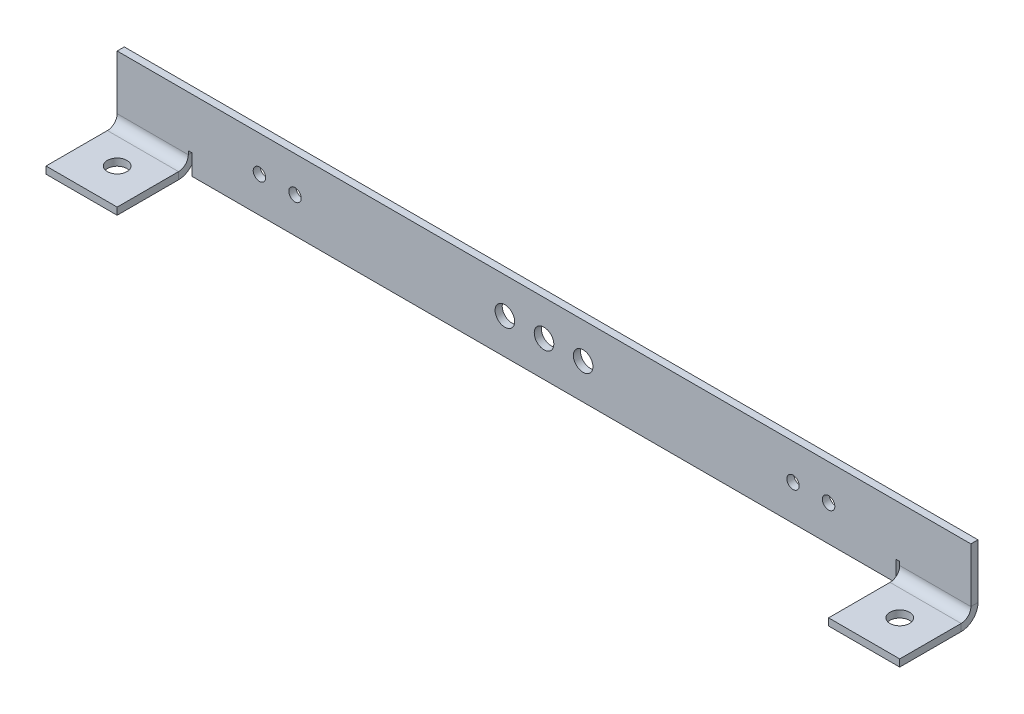
ISO-10303-21;
HEADER;
FILE_DESCRIPTION(('STEP AP214'),'2;1');
FILE_NAME('part.step','',(''),(''),'','','');
FILE_SCHEMA(('AUTOMOTIVE_DESIGN { 1 0 10303 214 1 1 1 1 }'));
ENDSEC;
DATA;
#1=APPLICATION_CONTEXT('core data for automotive mechanical design processes');
#2=APPLICATION_PROTOCOL_DEFINITION('international standard','automotive_design',2000,#1);
#3=PRODUCT_CONTEXT('',#1,'mechanical');
#4=PRODUCT('Part','Part','',(#3));
#5=PRODUCT_RELATED_PRODUCT_CATEGORY('part','',(#4));
#6=PRODUCT_DEFINITION_FORMATION('','',#4);
#7=PRODUCT_DEFINITION_CONTEXT('part definition',#1,'design');
#8=PRODUCT_DEFINITION('design','',#6,#7);
#9=PRODUCT_DEFINITION_SHAPE('','',#8);
#10=(LENGTH_UNIT() NAMED_UNIT(*) SI_UNIT(.MILLI.,.METRE.));
#11=(NAMED_UNIT(*) PLANE_ANGLE_UNIT() SI_UNIT($,.RADIAN.));
#12=(NAMED_UNIT(*) SI_UNIT($,.STERADIAN.) SOLID_ANGLE_UNIT());
#13=UNCERTAINTY_MEASURE_WITH_UNIT(LENGTH_MEASURE(1.E-05),#10,'distance_accuracy_value','');
#14=(GEOMETRIC_REPRESENTATION_CONTEXT(3) GLOBAL_UNCERTAINTY_ASSIGNED_CONTEXT((#13)) GLOBAL_UNIT_ASSIGNED_CONTEXT((#10,
#11,#12)) REPRESENTATION_CONTEXT('',''));
#15=CARTESIAN_POINT('',(0.,0.,0.));
#16=DIRECTION('',(0.,0.,1.));
#17=DIRECTION('',(1.,0.,0.));
#18=AXIS2_PLACEMENT_3D('',#15,#16,#17);
#19=CARTESIAN_POINT('',(120.,-20.,-2.));
#20=DIRECTION('',(0.,-1.,0.));
#21=DIRECTION('',(0.,0.,-1.));
#22=AXIS2_PLACEMENT_3D('',#19,#20,#21);
#23=PLANE('',#22);
#24=DIRECTION('',(1.,0.,0.));
#25=VECTOR('',#24,1.);
#26=CARTESIAN_POINT('',(120.,-20.,-2.));
#27=LINE('',#26,#25);
#28=CARTESIAN_POINT('',(-99.,-20.,-2.));
#29=VERTEX_POINT('',#28);
#30=CARTESIAN_POINT('',(99.,-20.,-2.));
#31=VERTEX_POINT('',#30);
#32=EDGE_CURVE('E359',#29,#31,#27,.T.);
#33=ORIENTED_EDGE('',*,*,#32,.T.);
#34=DIRECTION('',(0.,0.,-1.));
#35=VECTOR('',#34,1.);
#36=CARTESIAN_POINT('',(99.,-20.,0.));
#37=LINE('',#36,#35);
#38=CARTESIAN_POINT('',(99.,-20.,0.));
#39=VERTEX_POINT('',#38);
#40=EDGE_CURVE('E255',#39,#31,#37,.T.);
#41=ORIENTED_EDGE('',*,*,#40,.F.);
#42=DIRECTION('',(1.,0.,0.));
#43=VECTOR('',#42,1.);
#44=CARTESIAN_POINT('',(120.,-20.,0.));
#45=LINE('',#44,#43);
#46=CARTESIAN_POINT('',(-99.,-20.,0.));
#47=VERTEX_POINT('',#46);
#48=EDGE_CURVE('E130',#47,#39,#45,.T.);
#49=ORIENTED_EDGE('',*,*,#48,.F.);
#50=DIRECTION('',(0.,0.,-1.));
#51=VECTOR('',#50,1.);
#52=CARTESIAN_POINT('',(-99.,-20.,0.));
#53=LINE('',#52,#51);
#54=EDGE_CURVE('E340',#47,#29,#53,.T.);
#55=ORIENTED_EDGE('',*,*,#54,.T.);
#56=EDGE_LOOP('',(#33,#41,#49,#55));
#57=FACE_BOUND('',#56,.T.);
#58=ADVANCED_FACE('F79',(#57),#23,.T.);
#59=CARTESIAN_POINT('',(0.,0.,-2.));
#60=DIRECTION('',(0.,0.,1.));
#61=DIRECTION('',(1.,0.,0.));
#62=AXIS2_PLACEMENT_3D('',#59,#60,#61);
#63=PLANE('',#62);
#64=CARTESIAN_POINT('',(-70.,-9.99999999999998,-2.));
#65=DIRECTION('',(0.,0.,-1.));
#66=DIRECTION('',(1.,0.,0.));
#67=AXIS2_PLACEMENT_3D('',#64,#65,#66);
#68=CIRCLE('',#67,1.75);
#69=CARTESIAN_POINT('',(-68.25,-9.99999999999998,-2.));
#70=VERTEX_POINT('',#69);
#71=EDGE_CURVE('E657',#70,#70,#68,.T.);
#72=ORIENTED_EDGE('',*,*,#71,.F.);
#73=EDGE_LOOP('',(#72));
#74=FACE_BOUND('',#73,.T.);
#75=CARTESIAN_POINT('',(-80.,-9.99999999999998,-2.));
#76=DIRECTION('',(0.,0.,-1.));
#77=DIRECTION('',(1.,0.,0.));
#78=AXIS2_PLACEMENT_3D('',#75,#76,#77);
#79=CIRCLE('',#78,1.75);
#80=CARTESIAN_POINT('',(-78.25,-9.99999999999998,-2.));
#81=VERTEX_POINT('',#80);
#82=EDGE_CURVE('E652',#81,#81,#79,.T.);
#83=ORIENTED_EDGE('',*,*,#82,.F.);
#84=EDGE_LOOP('',(#83));
#85=FACE_BOUND('',#84,.T.);
#86=CARTESIAN_POINT('',(70.,-10.,-2.));
#87=DIRECTION('',(0.,0.,-1.));
#88=DIRECTION('',(-1.,0.,0.));
#89=AXIS2_PLACEMENT_3D('',#86,#87,#88);
#90=CIRCLE('',#89,1.75);
#91=CARTESIAN_POINT('',(68.25,-10.,-2.));
#92=VERTEX_POINT('',#91);
#93=EDGE_CURVE('E649',#92,#92,#90,.T.);
#94=ORIENTED_EDGE('',*,*,#93,.F.);
#95=EDGE_LOOP('',(#94));
#96=FACE_BOUND('',#95,.T.);
#97=CARTESIAN_POINT('',(11.,-10.,-2.));
#98=DIRECTION('',(0.,0.,-1.));
#99=DIRECTION('',(-1.,0.,0.));
#100=AXIS2_PLACEMENT_3D('',#97,#98,#99);
#101=CIRCLE('',#100,2.75);
#102=CARTESIAN_POINT('',(8.25,-10.,-2.));
#103=VERTEX_POINT('',#102);
#104=EDGE_CURVE('E159',#103,#103,#101,.T.);
#105=ORIENTED_EDGE('',*,*,#104,.F.);
#106=EDGE_LOOP('',(#105));
#107=FACE_BOUND('',#106,.T.);
#108=CARTESIAN_POINT('',(-11.,-10.,-2.));
#109=DIRECTION('',(0.,0.,-1.));
#110=DIRECTION('',(1.,0.,0.));
#111=AXIS2_PLACEMENT_3D('',#108,#109,#110);
#112=CIRCLE('',#111,2.75);
#113=CARTESIAN_POINT('',(-8.25,-10.,-2.));
#114=VERTEX_POINT('',#113);
#115=EDGE_CURVE('E655',#114,#114,#112,.T.);
#116=ORIENTED_EDGE('',*,*,#115,.F.);
#117=EDGE_LOOP('',(#116));
#118=FACE_BOUND('',#117,.T.);
#119=CARTESIAN_POINT('',(80.,-10.,-2.));
#120=DIRECTION('',(0.,0.,-1.));
#121=DIRECTION('',(-1.,0.,0.));
#122=AXIS2_PLACEMENT_3D('',#119,#120,#121);
#123=CIRCLE('',#122,1.75);
#124=CARTESIAN_POINT('',(78.25,-10.,-2.));
#125=VERTEX_POINT('',#124);
#126=EDGE_CURVE('E651',#125,#125,#123,.T.);
#127=ORIENTED_EDGE('',*,*,#126,.F.);
#128=EDGE_LOOP('',(#127));
#129=FACE_BOUND('',#128,.T.);
#130=CARTESIAN_POINT('',(0.,-10.,-2.));
#131=DIRECTION('',(0.,0.,-1.));
#132=DIRECTION('',(-1.,0.,0.));
#133=AXIS2_PLACEMENT_3D('',#130,#131,#132);
#134=CIRCLE('',#133,2.75);
#135=CARTESIAN_POINT('',(-2.75,-10.,-2.));
#136=VERTEX_POINT('',#135);
#137=EDGE_CURVE('E154',#136,#136,#134,.T.);
#138=ORIENTED_EDGE('',*,*,#137,.F.);
#139=EDGE_LOOP('',(#138));
#140=FACE_BOUND('',#139,.T.);
#141=DIRECTION('',(1.,0.,0.));
#142=VECTOR('',#141,1.);
#143=CARTESIAN_POINT('',(120.,-15.2634,-2.));
#144=LINE('',#143,#142);
#145=CARTESIAN_POINT('',(120.,-15.2634,-2.));
#146=VERTEX_POINT('',#145);
#147=CARTESIAN_POINT('',(100.,-15.2634,-2.));
#148=VERTEX_POINT('',#147);
#149=EDGE_CURVE('E223',#146,#148,#144,.F.);
#150=ORIENTED_EDGE('',*,*,#149,.T.);
#151=DIRECTION('',(0.,-1.,0.));
#152=VECTOR('',#151,1.);
#153=CARTESIAN_POINT('',(100.,0.,-2.));
#154=LINE('',#153,#152);
#155=CARTESIAN_POINT('',(100.,-14.2634,-2.));
#156=VERTEX_POINT('',#155);
#157=EDGE_CURVE('E267',#156,#148,#154,.T.);
#158=ORIENTED_EDGE('',*,*,#157,.F.);
#159=DIRECTION('',(1.,0.,0.));
#160=VECTOR('',#159,1.);
#161=CARTESIAN_POINT('',(0.,-14.2634,-2.));
#162=LINE('',#161,#160);
#163=CARTESIAN_POINT('',(99.,-14.2634,-2.));
#164=VERTEX_POINT('',#163);
#165=EDGE_CURVE('E264',#164,#156,#162,.T.);
#166=ORIENTED_EDGE('',*,*,#165,.F.);
#167=DIRECTION('',(0.,1.,0.));
#168=VECTOR('',#167,1.);
#169=CARTESIAN_POINT('',(99.,0.,-2.));
#170=LINE('',#169,#168);
#171=EDGE_CURVE('E247',#31,#164,#170,.T.);
#172=ORIENTED_EDGE('',*,*,#171,.F.);
#173=ORIENTED_EDGE('',*,*,#32,.F.);
#174=DIRECTION('',(0.,-1.,0.));
#175=VECTOR('',#174,1.);
#176=CARTESIAN_POINT('',(-99.,0.,-2.));
#177=LINE('',#176,#175);
#178=CARTESIAN_POINT('',(-99.,-14.2634,-2.));
#179=VERTEX_POINT('',#178);
#180=EDGE_CURVE('E138',#179,#29,#177,.T.);
#181=ORIENTED_EDGE('',*,*,#180,.F.);
#182=DIRECTION('',(1.,0.,0.));
#183=VECTOR('',#182,1.);
#184=CARTESIAN_POINT('',(0.,-14.2634,-2.));
#185=LINE('',#184,#183);
#186=CARTESIAN_POINT('',(-100.,-14.2634,-2.));
#187=VERTEX_POINT('',#186);
#188=EDGE_CURVE('E142',#187,#179,#185,.T.);
#189=ORIENTED_EDGE('',*,*,#188,.F.);
#190=DIRECTION('',(0.,1.,0.));
#191=VECTOR('',#190,1.);
#192=CARTESIAN_POINT('',(-100.,0.,-2.));
#193=LINE('',#192,#191);
#194=CARTESIAN_POINT('',(-100.,-15.2634,-2.));
#195=VERTEX_POINT('',#194);
#196=EDGE_CURVE('E339',#195,#187,#193,.T.);
#197=ORIENTED_EDGE('',*,*,#196,.F.);
#198=DIRECTION('',(1.,0.,0.));
#199=VECTOR('',#198,1.);
#200=CARTESIAN_POINT('',(-100.,-15.2634,-2.));
#201=LINE('',#200,#199);
#202=CARTESIAN_POINT('',(-120.,-15.2634,-2.));
#203=VERTEX_POINT('',#202);
#204=EDGE_CURVE('E313',#195,#203,#201,.F.);
#205=ORIENTED_EDGE('',*,*,#204,.T.);
#206=DIRECTION('',(0.,-1.,0.));
#207=VECTOR('',#206,1.);
#208=CARTESIAN_POINT('',(-120.,-20.,-2.));
#209=LINE('',#208,#207);
#210=CARTESIAN_POINT('',(-120.,0.,-2.));
#211=VERTEX_POINT('',#210);
#212=EDGE_CURVE('E357',#211,#203,#209,.T.);
#213=ORIENTED_EDGE('',*,*,#212,.F.);
#214=DIRECTION('',(-1.,0.,0.));
#215=VECTOR('',#214,1.);
#216=CARTESIAN_POINT('',(-120.,0.,-2.));
#217=LINE('',#216,#215);
#218=CARTESIAN_POINT('',(120.,0.,-2.));
#219=VERTEX_POINT('',#218);
#220=EDGE_CURVE('E129',#219,#211,#217,.T.);
#221=ORIENTED_EDGE('',*,*,#220,.F.);
#222=DIRECTION('',(0.,1.,0.));
#223=VECTOR('',#222,1.);
#224=CARTESIAN_POINT('',(120.,-20.,-2.));
#225=LINE('',#224,#223);
#226=EDGE_CURVE('E104',#146,#219,#225,.T.);
#227=ORIENTED_EDGE('',*,*,#226,.F.);
#228=EDGE_LOOP('',(#150,#158,#166,#172,#173,#181,#189,#197,#205,#213,#221,#227));
#229=FACE_BOUND('',#228,.T.);
#230=ADVANCED_FACE('F374',(#74,#85,#96,#107,#118,#129,#140,#229),#63,.F.);
#231=CARTESIAN_POINT('',(0.,0.,0.));
#232=DIRECTION('',(0.,0.,1.));
#233=DIRECTION('',(1.,0.,0.));
#234=AXIS2_PLACEMENT_3D('',#231,#232,#233);
#235=PLANE('',#234);
#236=CARTESIAN_POINT('',(-70.,-9.99999999999998,0.));
#237=DIRECTION('',(0.,0.,1.));
#238=DIRECTION('',(1.,0.,0.));
#239=AXIS2_PLACEMENT_3D('',#236,#237,#238);
#240=CIRCLE('',#239,1.75);
#241=CARTESIAN_POINT('',(-68.25,-9.99999999999998,0.));
#242=VERTEX_POINT('',#241);
#243=EDGE_CURVE('E83',#242,#242,#240,.T.);
#244=ORIENTED_EDGE('',*,*,#243,.F.);
#245=EDGE_LOOP('',(#244));
#246=FACE_BOUND('',#245,.T.);
#247=CARTESIAN_POINT('',(-80.,-9.99999999999998,0.));
#248=DIRECTION('',(0.,0.,1.));
#249=DIRECTION('',(1.,0.,0.));
#250=AXIS2_PLACEMENT_3D('',#247,#248,#249);
#251=CIRCLE('',#250,1.75);
#252=CARTESIAN_POINT('',(-78.25,-9.99999999999998,0.));
#253=VERTEX_POINT('',#252);
#254=EDGE_CURVE('E167',#253,#253,#251,.T.);
#255=ORIENTED_EDGE('',*,*,#254,.F.);
#256=EDGE_LOOP('',(#255));
#257=FACE_BOUND('',#256,.T.);
#258=CARTESIAN_POINT('',(70.,-10.,0.));
#259=DIRECTION('',(0.,0.,1.));
#260=DIRECTION('',(1.,0.,0.));
#261=AXIS2_PLACEMENT_3D('',#258,#259,#260);
#262=CIRCLE('',#261,1.75);
#263=CARTESIAN_POINT('',(71.75,-10.,0.));
#264=VERTEX_POINT('',#263);
#265=EDGE_CURVE('E165',#264,#264,#262,.T.);
#266=ORIENTED_EDGE('',*,*,#265,.F.);
#267=EDGE_LOOP('',(#266));
#268=FACE_BOUND('',#267,.T.);
#269=CARTESIAN_POINT('',(11.,-10.,0.));
#270=DIRECTION('',(0.,0.,1.));
#271=DIRECTION('',(1.,0.,0.));
#272=AXIS2_PLACEMENT_3D('',#269,#270,#271);
#273=CIRCLE('',#272,2.75);
#274=CARTESIAN_POINT('',(13.75,-10.,0.));
#275=VERTEX_POINT('',#274);
#276=EDGE_CURVE('E162',#275,#275,#273,.T.);
#277=ORIENTED_EDGE('',*,*,#276,.F.);
#278=EDGE_LOOP('',(#277));
#279=FACE_BOUND('',#278,.T.);
#280=CARTESIAN_POINT('',(-11.,-10.,0.));
#281=DIRECTION('',(0.,0.,1.));
#282=DIRECTION('',(1.,0.,0.));
#283=AXIS2_PLACEMENT_3D('',#280,#281,#282);
#284=CIRCLE('',#283,2.75);
#285=CARTESIAN_POINT('',(-8.25,-10.,0.));
#286=VERTEX_POINT('',#285);
#287=EDGE_CURVE('E158',#286,#286,#284,.T.);
#288=ORIENTED_EDGE('',*,*,#287,.F.);
#289=EDGE_LOOP('',(#288));
#290=FACE_BOUND('',#289,.T.);
#291=CARTESIAN_POINT('',(80.,-10.,0.));
#292=DIRECTION('',(0.,0.,1.));
#293=DIRECTION('',(1.,0.,0.));
#294=AXIS2_PLACEMENT_3D('',#291,#292,#293);
#295=CIRCLE('',#294,1.75);
#296=CARTESIAN_POINT('',(81.75,-10.,0.));
#297=VERTEX_POINT('',#296);
#298=EDGE_CURVE('E155',#297,#297,#295,.T.);
#299=ORIENTED_EDGE('',*,*,#298,.F.);
#300=EDGE_LOOP('',(#299));
#301=FACE_BOUND('',#300,.T.);
#302=CARTESIAN_POINT('',(0.,-10.,0.));
#303=DIRECTION('',(0.,0.,1.));
#304=DIRECTION('',(1.,0.,0.));
#305=AXIS2_PLACEMENT_3D('',#302,#303,#304);
#306=CIRCLE('',#305,2.75);
#307=CARTESIAN_POINT('',(2.75,-10.,0.));
#308=VERTEX_POINT('',#307);
#309=EDGE_CURVE('E150',#308,#308,#306,.T.);
#310=ORIENTED_EDGE('',*,*,#309,.F.);
#311=EDGE_LOOP('',(#310));
#312=FACE_BOUND('',#311,.T.);
#313=DIRECTION('',(0.,1.,0.));
#314=VECTOR('',#313,1.);
#315=CARTESIAN_POINT('',(100.,-15.2634,0.));
#316=LINE('',#315,#314);
#317=CARTESIAN_POINT('',(100.,-15.2634,0.));
#318=VERTEX_POINT('',#317);
#319=CARTESIAN_POINT('',(100.,-14.2634,0.));
#320=VERTEX_POINT('',#319);
#321=EDGE_CURVE('E244',#318,#320,#316,.T.);
#322=ORIENTED_EDGE('',*,*,#321,.F.);
#323=DIRECTION('',(1.,0.,0.));
#324=VECTOR('',#323,1.);
#325=CARTESIAN_POINT('',(120.,-15.2634,0.));
#326=LINE('',#325,#324);
#327=CARTESIAN_POINT('',(120.,-15.2634,0.));
#328=VERTEX_POINT('',#327);
#329=EDGE_CURVE('E127',#328,#318,#326,.F.);
#330=ORIENTED_EDGE('',*,*,#329,.F.);
#331=DIRECTION('',(0.,1.,0.));
#332=VECTOR('',#331,1.);
#333=CARTESIAN_POINT('',(120.,-20.,0.));
#334=LINE('',#333,#332);
#335=CARTESIAN_POINT('',(120.,0.,0.));
#336=VERTEX_POINT('',#335);
#337=EDGE_CURVE('E119',#328,#336,#334,.T.);
#338=ORIENTED_EDGE('',*,*,#337,.T.);
#339=DIRECTION('',(-1.,0.,0.));
#340=VECTOR('',#339,1.);
#341=CARTESIAN_POINT('',(-120.,0.,0.));
#342=LINE('',#341,#340);
#343=CARTESIAN_POINT('',(-120.,0.,0.));
#344=VERTEX_POINT('',#343);
#345=EDGE_CURVE('E124',#336,#344,#342,.T.);
#346=ORIENTED_EDGE('',*,*,#345,.T.);
#347=DIRECTION('',(0.,-1.,0.));
#348=VECTOR('',#347,1.);
#349=CARTESIAN_POINT('',(-120.,-20.,0.));
#350=LINE('',#349,#348);
#351=CARTESIAN_POINT('',(-120.,-15.2634,0.));
#352=VERTEX_POINT('',#351);
#353=EDGE_CURVE('E137',#344,#352,#350,.T.);
#354=ORIENTED_EDGE('',*,*,#353,.T.);
#355=DIRECTION('',(1.,0.,0.));
#356=VECTOR('',#355,1.);
#357=CARTESIAN_POINT('',(-100.,-15.2634,0.));
#358=LINE('',#357,#356);
#359=CARTESIAN_POINT('',(-100.,-15.2634,0.));
#360=VERTEX_POINT('',#359);
#361=EDGE_CURVE('E326',#360,#352,#358,.F.);
#362=ORIENTED_EDGE('',*,*,#361,.F.);
#363=DIRECTION('',(0.,-1.,0.));
#364=VECTOR('',#363,1.);
#365=CARTESIAN_POINT('',(-100.,-14.2634,0.));
#366=LINE('',#365,#364);
#367=CARTESIAN_POINT('',(-100.,-14.2634,0.));
#368=VERTEX_POINT('',#367);
#369=EDGE_CURVE('E96',#368,#360,#366,.T.);
#370=ORIENTED_EDGE('',*,*,#369,.F.);
#371=DIRECTION('',(-1.,0.,0.));
#372=VECTOR('',#371,1.);
#373=CARTESIAN_POINT('',(-99.,-14.2634,0.));
#374=LINE('',#373,#372);
#375=CARTESIAN_POINT('',(-99.,-14.2634,0.));
#376=VERTEX_POINT('',#375);
#377=EDGE_CURVE('E341',#376,#368,#374,.T.);
#378=ORIENTED_EDGE('',*,*,#377,.F.);
#379=DIRECTION('',(0.,1.,0.));
#380=VECTOR('',#379,1.);
#381=CARTESIAN_POINT('',(-99.,-20.,0.));
#382=LINE('',#381,#380);
#383=EDGE_CURVE('E336',#47,#376,#382,.T.);
#384=ORIENTED_EDGE('',*,*,#383,.F.);
#385=ORIENTED_EDGE('',*,*,#48,.T.);
#386=DIRECTION('',(0.,-1.,0.));
#387=VECTOR('',#386,1.);
#388=CARTESIAN_POINT('',(99.,-14.2634,0.));
#389=LINE('',#388,#387);
#390=CARTESIAN_POINT('',(99.,-14.2634,0.));
#391=VERTEX_POINT('',#390);
#392=EDGE_CURVE('E252',#391,#39,#389,.T.);
#393=ORIENTED_EDGE('',*,*,#392,.F.);
#394=DIRECTION('',(-1.,0.,0.));
#395=VECTOR('',#394,1.);
#396=CARTESIAN_POINT('',(100.,-14.2634,0.));
#397=LINE('',#396,#395);
#398=EDGE_CURVE('E248',#320,#391,#397,.T.);
#399=ORIENTED_EDGE('',*,*,#398,.F.);
#400=EDGE_LOOP('',(#322,#330,#338,#346,#354,#362,#370,#378,#384,#385,#393,#399));
#401=FACE_BOUND('',#400,.T.);
#402=ADVANCED_FACE('F121',(#246,#257,#268,#279,#290,#301,#312,#401),#235,.T.);
#403=CARTESIAN_POINT('',(120.,-20.,-2.));
#404=DIRECTION('',(1.,0.,0.));
#405=DIRECTION('',(0.,0.,-1.));
#406=AXIS2_PLACEMENT_3D('',#403,#404,#405);
#407=PLANE('',#406);
#408=ORIENTED_EDGE('',*,*,#337,.F.);
#409=DIRECTION('',(0.,0.,-1.));
#410=VECTOR('',#409,1.);
#411=CARTESIAN_POINT('',(120.,-15.2634,0.));
#412=LINE('',#411,#410);
#413=EDGE_CURVE('E230',#328,#146,#412,.T.);
#414=ORIENTED_EDGE('',*,*,#413,.T.);
#415=ORIENTED_EDGE('',*,*,#226,.T.);
#416=DIRECTION('',(0.,0.,1.));
#417=VECTOR('',#416,1.);
#418=CARTESIAN_POINT('',(120.,0.,-2.));
#419=LINE('',#418,#417);
#420=EDGE_CURVE('E13',#219,#336,#419,.T.);
#421=ORIENTED_EDGE('',*,*,#420,.T.);
#422=EDGE_LOOP('',(#408,#414,#415,#421));
#423=FACE_BOUND('',#422,.T.);
#424=ADVANCED_FACE('F132',(#423),#407,.T.);
#425=CARTESIAN_POINT('',(-120.,0.,-2.));
#426=DIRECTION('',(0.,1.,0.));
#427=DIRECTION('',(0.,0.,1.));
#428=AXIS2_PLACEMENT_3D('',#425,#426,#427);
#429=PLANE('',#428);
#430=ORIENTED_EDGE('',*,*,#345,.F.);
#431=ORIENTED_EDGE('',*,*,#420,.F.);
#432=ORIENTED_EDGE('',*,*,#220,.T.);
#433=DIRECTION('',(0.,0.,1.));
#434=VECTOR('',#433,1.);
#435=CARTESIAN_POINT('',(-120.,0.,-2.));
#436=LINE('',#435,#434);
#437=EDGE_CURVE('E88',#211,#344,#436,.T.);
#438=ORIENTED_EDGE('',*,*,#437,.T.);
#439=EDGE_LOOP('',(#430,#431,#432,#438));
#440=FACE_BOUND('',#439,.T.);
#441=ADVANCED_FACE('F81',(#440),#429,.T.);
#442=CARTESIAN_POINT('',(-120.,-20.,-2.));
#443=DIRECTION('',(-1.,0.,0.));
#444=DIRECTION('',(0.,0.,1.));
#445=AXIS2_PLACEMENT_3D('',#442,#443,#444);
#446=PLANE('',#445);
#447=DIRECTION('',(0.,0.,-1.));
#448=VECTOR('',#447,1.);
#449=CARTESIAN_POINT('',(-120.,-15.2634,0.));
#450=LINE('',#449,#448);
#451=EDGE_CURVE('E331',#352,#203,#450,.T.);
#452=ORIENTED_EDGE('',*,*,#451,.F.);
#453=ORIENTED_EDGE('',*,*,#353,.F.);
#454=ORIENTED_EDGE('',*,*,#437,.F.);
#455=ORIENTED_EDGE('',*,*,#212,.T.);
#456=EDGE_LOOP('',(#452,#453,#454,#455));
#457=FACE_BOUND('',#456,.T.);
#458=ADVANCED_FACE('F506',(#457),#446,.T.);
#459=CARTESIAN_POINT('',(-99.,-20.,0.));
#460=DIRECTION('',(-1.,0.,0.));
#461=DIRECTION('',(0.,0.,1.));
#462=AXIS2_PLACEMENT_3D('',#459,#460,#461);
#463=PLANE('',#462);
#464=DIRECTION('',(0.,0.,-1.));
#465=VECTOR('',#464,1.);
#466=CARTESIAN_POINT('',(-99.,-14.2634,0.));
#467=LINE('',#466,#465);
#468=EDGE_CURVE('E344',#376,#179,#467,.T.);
#469=ORIENTED_EDGE('',*,*,#468,.T.);
#470=ORIENTED_EDGE('',*,*,#180,.T.);
#471=ORIENTED_EDGE('',*,*,#54,.F.);
#472=ORIENTED_EDGE('',*,*,#383,.T.);
#473=EDGE_LOOP('',(#469,#470,#471,#472));
#474=FACE_BOUND('',#473,.T.);
#475=ADVANCED_FACE('F508',(#474),#463,.T.);
#476=CARTESIAN_POINT('',(-99.,-14.2634,0.));
#477=DIRECTION('',(0.,-1.,0.));
#478=DIRECTION('',(0.,0.,-1.));
#479=AXIS2_PLACEMENT_3D('',#476,#477,#478);
#480=PLANE('',#479);
#481=DIRECTION('',(0.,0.,-1.));
#482=VECTOR('',#481,1.);
#483=CARTESIAN_POINT('',(-100.,-14.2634,0.));
#484=LINE('',#483,#482);
#485=EDGE_CURVE('E334',#368,#187,#484,.T.);
#486=ORIENTED_EDGE('',*,*,#485,.T.);
#487=ORIENTED_EDGE('',*,*,#188,.T.);
#488=ORIENTED_EDGE('',*,*,#468,.F.);
#489=ORIENTED_EDGE('',*,*,#377,.T.);
#490=EDGE_LOOP('',(#486,#487,#488,#489));
#491=FACE_BOUND('',#490,.T.);
#492=ADVANCED_FACE('F514',(#491),#480,.T.);
#493=CARTESIAN_POINT('',(-100.,-14.2634,0.));
#494=DIRECTION('',(1.,0.,0.));
#495=DIRECTION('',(0.,0.,-1.));
#496=AXIS2_PLACEMENT_3D('',#493,#494,#495);
#497=PLANE('',#496);
#498=DIRECTION('',(0.,0.,-1.));
#499=VECTOR('',#498,1.);
#500=CARTESIAN_POINT('',(-100.,-15.2634,0.));
#501=LINE('',#500,#499);
#502=EDGE_CURVE('E320',#360,#195,#501,.T.);
#503=ORIENTED_EDGE('',*,*,#502,.T.);
#504=ORIENTED_EDGE('',*,*,#196,.T.);
#505=ORIENTED_EDGE('',*,*,#485,.F.);
#506=ORIENTED_EDGE('',*,*,#369,.T.);
#507=EDGE_LOOP('',(#503,#504,#505,#506));
#508=FACE_BOUND('',#507,.T.);
#509=ADVANCED_FACE('F547',(#508),#497,.T.);
#510=CARTESIAN_POINT('',(-120.,-15.2634,2.7366));
#511=DIRECTION('',(-1.,0.,0.));
#512=DIRECTION('',(0.,0.,1.));
#513=AXIS2_PLACEMENT_3D('',#510,#511,#512);
#514=PLANE('',#513);
#515=DIRECTION('',(0.,-1.,0.));
#516=VECTOR('',#515,1.);
#517=CARTESIAN_POINT('',(-120.,-20.,2.73659999999999));
#518=LINE('',#517,#516);
#519=CARTESIAN_POINT('',(-120.,-18.,2.73659999999999));
#520=VERTEX_POINT('',#519);
#521=CARTESIAN_POINT('',(-120.,-20.,2.73659999999998));
#522=VERTEX_POINT('',#521);
#523=EDGE_CURVE('E276',#520,#522,#518,.T.);
#524=ORIENTED_EDGE('',*,*,#523,.F.);
#525=CARTESIAN_POINT('',(-120.,-15.2634,2.7366));
#526=DIRECTION('',(1.,0.,0.));
#527=DIRECTION('',(0.,0.,-1.));
#528=AXIS2_PLACEMENT_3D('',#525,#526,#527);
#529=CIRCLE('',#528,2.7366);
#530=EDGE_CURVE('E323',#352,#520,#529,.F.);
#531=ORIENTED_EDGE('',*,*,#530,.F.);
#532=ORIENTED_EDGE('',*,*,#451,.T.);
#533=CARTESIAN_POINT('',(-120.,-15.2634,2.7366));
#534=DIRECTION('',(1.,0.,0.));
#535=DIRECTION('',(0.,0.,-1.));
#536=AXIS2_PLACEMENT_3D('',#533,#534,#535);
#537=CIRCLE('',#536,4.7366);
#538=EDGE_CURVE('E316',#203,#522,#537,.F.);
#539=ORIENTED_EDGE('',*,*,#538,.T.);
#540=EDGE_LOOP('',(#524,#531,#532,#539));
#541=FACE_BOUND('',#540,.T.);
#542=ADVANCED_FACE('F525',(#541),#514,.T.);
#543=CARTESIAN_POINT('',(-100.,-15.2634,2.7366));
#544=DIRECTION('',(-1.,0.,0.));
#545=DIRECTION('',(0.,0.,1.));
#546=AXIS2_PLACEMENT_3D('',#543,#544,#545);
#547=PLANE('',#546);
#548=CARTESIAN_POINT('',(-100.,-15.2634,2.7366));
#549=DIRECTION('',(1.,0.,0.));
#550=DIRECTION('',(0.,0.,-1.));
#551=AXIS2_PLACEMENT_3D('',#548,#549,#550);
#552=CIRCLE('',#551,2.7366);
#553=CARTESIAN_POINT('',(-100.,-18.,2.73659999999999));
#554=VERTEX_POINT('',#553);
#555=EDGE_CURVE('E280',#554,#360,#552,.T.);
#556=ORIENTED_EDGE('',*,*,#555,.F.);
#557=DIRECTION('',(0.,-1.,0.));
#558=VECTOR('',#557,1.);
#559=CARTESIAN_POINT('',(-100.,-18.,2.73659999999999));
#560=LINE('',#559,#558);
#561=CARTESIAN_POINT('',(-100.,-20.,2.73659999999998));
#562=VERTEX_POINT('',#561);
#563=EDGE_CURVE('E305',#554,#562,#560,.T.);
#564=ORIENTED_EDGE('',*,*,#563,.T.);
#565=CARTESIAN_POINT('',(-100.,-15.2634,2.7366));
#566=DIRECTION('',(1.,0.,0.));
#567=DIRECTION('',(0.,0.,-1.));
#568=AXIS2_PLACEMENT_3D('',#565,#566,#567);
#569=CIRCLE('',#568,4.7366);
#570=EDGE_CURVE('E317',#562,#195,#569,.T.);
#571=ORIENTED_EDGE('',*,*,#570,.T.);
#572=ORIENTED_EDGE('',*,*,#502,.F.);
#573=EDGE_LOOP('',(#556,#564,#571,#572));
#574=FACE_BOUND('',#573,.T.);
#575=ADVANCED_FACE('F545',(#574),#547,.F.);
#576=CARTESIAN_POINT('',(-100.,-15.2634,2.7366));
#577=DIRECTION('',(1.,0.,0.));
#578=DIRECTION('',(0.,-1.,0.));
#579=AXIS2_PLACEMENT_3D('',#576,#577,#578);
#580=CYLINDRICAL_SURFACE('',#579,4.7366);
#581=ORIENTED_EDGE('',*,*,#204,.F.);
#582=ORIENTED_EDGE('',*,*,#570,.F.);
#583=DIRECTION('',(1.,0.,0.));
#584=VECTOR('',#583,1.);
#585=CARTESIAN_POINT('',(0.,-20.,2.73659999999996));
#586=LINE('',#585,#584);
#587=EDGE_CURVE('E302',#522,#562,#586,.T.);
#588=ORIENTED_EDGE('',*,*,#587,.F.);
#589=ORIENTED_EDGE('',*,*,#538,.F.);
#590=EDGE_LOOP('',(#581,#582,#588,#589));
#591=FACE_BOUND('',#590,.T.);
#592=ADVANCED_FACE('F549',(#591),#580,.T.);
#593=CARTESIAN_POINT('',(-100.,-15.2634,2.7366));
#594=DIRECTION('',(1.,0.,0.));
#595=DIRECTION('',(0.,-1.,0.));
#596=AXIS2_PLACEMENT_3D('',#593,#594,#595);
#597=CYLINDRICAL_SURFACE('',#596,2.7366);
#598=ORIENTED_EDGE('',*,*,#361,.T.);
#599=ORIENTED_EDGE('',*,*,#530,.T.);
#600=DIRECTION('',(-1.,0.,0.));
#601=VECTOR('',#600,1.);
#602=CARTESIAN_POINT('',(-120.,-18.,2.73659999999999));
#603=LINE('',#602,#601);
#604=EDGE_CURVE('E308',#520,#554,#603,.F.);
#605=ORIENTED_EDGE('',*,*,#604,.T.);
#606=ORIENTED_EDGE('',*,*,#555,.T.);
#607=EDGE_LOOP('',(#598,#599,#605,#606));
#608=FACE_BOUND('',#607,.T.);
#609=ADVANCED_FACE('F522',(#608),#597,.F.);
#610=CARTESIAN_POINT('',(-100.,-20.,0.));
#611=DIRECTION('',(1.,0.,0.));
#612=DIRECTION('',(0.,0.,-1.));
#613=AXIS2_PLACEMENT_3D('',#610,#611,#612);
#614=PLANE('',#613);
#615=DIRECTION('',(0.,0.,-1.));
#616=VECTOR('',#615,1.);
#617=CARTESIAN_POINT('',(-100.,-20.,0.));
#618=LINE('',#617,#616);
#619=CARTESIAN_POINT('',(-100.,-20.0000000000001,20.));
#620=VERTEX_POINT('',#619);
#621=EDGE_CURVE('E284',#620,#562,#618,.T.);
#622=ORIENTED_EDGE('',*,*,#621,.T.);
#623=ORIENTED_EDGE('',*,*,#563,.F.);
#624=DIRECTION('',(0.,0.,1.));
#625=VECTOR('',#624,1.);
#626=CARTESIAN_POINT('',(-100.,-18.,-1.38777878078145E-13));
#627=LINE('',#626,#625);
#628=CARTESIAN_POINT('',(-100.,-18.0000000000001,20.));
#629=VERTEX_POINT('',#628);
#630=EDGE_CURVE('E293',#629,#554,#627,.F.);
#631=ORIENTED_EDGE('',*,*,#630,.F.);
#632=DIRECTION('',(0.,1.,0.));
#633=VECTOR('',#632,1.);
#634=CARTESIAN_POINT('',(-100.,-20.0000000000001,20.));
#635=LINE('',#634,#633);
#636=EDGE_CURVE('E277',#620,#629,#635,.T.);
#637=ORIENTED_EDGE('',*,*,#636,.F.);
#638=EDGE_LOOP('',(#622,#623,#631,#637));
#639=FACE_BOUND('',#638,.T.);
#640=ADVANCED_FACE('F543',(#639),#614,.T.);
#641=CARTESIAN_POINT('',(-120.,-20.0000000000001,20.));
#642=DIRECTION('',(-1.,0.,0.));
#643=DIRECTION('',(0.,0.,1.));
#644=AXIS2_PLACEMENT_3D('',#641,#642,#643);
#645=PLANE('',#644);
#646=DIRECTION('',(0.,0.,-1.));
#647=VECTOR('',#646,1.);
#648=CARTESIAN_POINT('',(-120.,-18.,0.));
#649=LINE('',#648,#647);
#650=CARTESIAN_POINT('',(-120.,-18.0000000000001,20.));
#651=VERTEX_POINT('',#650);
#652=EDGE_CURVE('E299',#520,#651,#649,.F.);
#653=ORIENTED_EDGE('',*,*,#652,.F.);
#654=ORIENTED_EDGE('',*,*,#523,.T.);
#655=DIRECTION('',(0.,0.,1.));
#656=VECTOR('',#655,1.);
#657=CARTESIAN_POINT('',(-120.,-20.0000000000001,20.));
#658=LINE('',#657,#656);
#659=CARTESIAN_POINT('',(-120.,-20.0000000000001,20.));
#660=VERTEX_POINT('',#659);
#661=EDGE_CURVE('E290',#522,#660,#658,.T.);
#662=ORIENTED_EDGE('',*,*,#661,.T.);
#663=DIRECTION('',(0.,1.,0.));
#664=VECTOR('',#663,1.);
#665=CARTESIAN_POINT('',(-120.,-20.0000000000001,20.));
#666=LINE('',#665,#664);
#667=EDGE_CURVE('E281',#660,#651,#666,.T.);
#668=ORIENTED_EDGE('',*,*,#667,.T.);
#669=EDGE_LOOP('',(#653,#654,#662,#668));
#670=FACE_BOUND('',#669,.T.);
#671=ADVANCED_FACE('F529',(#670),#645,.T.);
#672=CARTESIAN_POINT('',(0.,-20.,0.));
#673=DIRECTION('',(0.,-1.,0.));
#674=DIRECTION('',(0.,0.,-1.));
#675=AXIS2_PLACEMENT_3D('',#672,#673,#674);
#676=PLANE('',#675);
#677=CARTESIAN_POINT('',(-110.,-20.0000000000001,9.99999999999999));
#678=DIRECTION('',(0.,-1.,0.));
#679=DIRECTION('',(0.,0.,-1.));
#680=AXIS2_PLACEMENT_3D('',#677,#678,#679);
#681=CIRCLE('',#680,2.75000000000001);
#682=CARTESIAN_POINT('',(-110.,-20.,7.24999999999998));
#683=VERTEX_POINT('',#682);
#684=EDGE_CURVE('E273',#683,#683,#681,.T.);
#685=ORIENTED_EDGE('',*,*,#684,.F.);
#686=EDGE_LOOP('',(#685));
#687=FACE_BOUND('',#686,.T.);
#688=ORIENTED_EDGE('',*,*,#661,.F.);
#689=ORIENTED_EDGE('',*,*,#587,.T.);
#690=ORIENTED_EDGE('',*,*,#621,.F.);
#691=DIRECTION('',(1.,0.,0.));
#692=VECTOR('',#691,1.);
#693=CARTESIAN_POINT('',(-100.,-20.0000000000001,20.));
#694=LINE('',#693,#692);
#695=EDGE_CURVE('E287',#660,#620,#694,.T.);
#696=ORIENTED_EDGE('',*,*,#695,.F.);
#697=EDGE_LOOP('',(#688,#689,#690,#696));
#698=FACE_BOUND('',#697,.T.);
#699=ADVANCED_FACE('F533',(#687,#698),#676,.T.);
#700=CARTESIAN_POINT('',(0.,-18.,0.));
#701=DIRECTION('',(0.,-1.,0.));
#702=DIRECTION('',(0.,0.,-1.));
#703=AXIS2_PLACEMENT_3D('',#700,#701,#702);
#704=PLANE('',#703);
#705=CARTESIAN_POINT('',(-110.,-18.0000000000001,10.));
#706=DIRECTION('',(0.,1.,0.));
#707=DIRECTION('',(0.,0.,1.));
#708=AXIS2_PLACEMENT_3D('',#705,#706,#707);
#709=CIRCLE('',#708,2.75000000000001);
#710=CARTESIAN_POINT('',(-110.,-18.0000000000001,12.75));
#711=VERTEX_POINT('',#710);
#712=EDGE_CURVE('E270',#711,#711,#709,.T.);
#713=ORIENTED_EDGE('',*,*,#712,.F.);
#714=EDGE_LOOP('',(#713));
#715=FACE_BOUND('',#714,.T.);
#716=ORIENTED_EDGE('',*,*,#604,.F.);
#717=ORIENTED_EDGE('',*,*,#652,.T.);
#718=DIRECTION('',(-1.,0.,0.));
#719=VECTOR('',#718,1.);
#720=CARTESIAN_POINT('',(0.,-18.0000000000001,20.));
#721=LINE('',#720,#719);
#722=EDGE_CURVE('E296',#651,#629,#721,.F.);
#723=ORIENTED_EDGE('',*,*,#722,.T.);
#724=ORIENTED_EDGE('',*,*,#630,.T.);
#725=EDGE_LOOP('',(#716,#717,#723,#724));
#726=FACE_BOUND('',#725,.T.);
#727=ADVANCED_FACE('F540',(#715,#726),#704,.F.);
#728=CARTESIAN_POINT('',(-100.,-20.0000000000001,20.));
#729=DIRECTION('',(0.,0.,1.));
#730=DIRECTION('',(0.,-1.,0.));
#731=AXIS2_PLACEMENT_3D('',#728,#729,#730);
#732=PLANE('',#731);
#733=ORIENTED_EDGE('',*,*,#722,.F.);
#734=ORIENTED_EDGE('',*,*,#667,.F.);
#735=ORIENTED_EDGE('',*,*,#695,.T.);
#736=ORIENTED_EDGE('',*,*,#636,.T.);
#737=EDGE_LOOP('',(#733,#734,#735,#736));
#738=FACE_BOUND('',#737,.T.);
#739=ADVANCED_FACE('F537',(#738),#732,.T.);
#740=CARTESIAN_POINT('',(-110.,-28.0000000000001,9.99999999999996));
#741=DIRECTION('',(0.,1.,0.));
#742=DIRECTION('',(0.,0.,1.));
#743=AXIS2_PLACEMENT_3D('',#740,#741,#742);
#744=CYLINDRICAL_SURFACE('',#743,2.75000000000001);
#745=ORIENTED_EDGE('',*,*,#684,.T.);
#746=EDGE_LOOP('',(#745));
#747=FACE_BOUND('',#746,.T.);
#748=ORIENTED_EDGE('',*,*,#712,.T.);
#749=EDGE_LOOP('',(#748));
#750=FACE_BOUND('',#749,.T.);
#751=ADVANCED_FACE('F563',(#747,#750),#744,.F.);
#752=CARTESIAN_POINT('',(100.,-15.2634,0.));
#753=DIRECTION('',(-1.,0.,0.));
#754=DIRECTION('',(0.,0.,1.));
#755=AXIS2_PLACEMENT_3D('',#752,#753,#754);
#756=PLANE('',#755);
#757=DIRECTION('',(0.,0.,-1.));
#758=VECTOR('',#757,1.);
#759=CARTESIAN_POINT('',(100.,-14.2634,0.));
#760=LINE('',#759,#758);
#761=EDGE_CURVE('E251',#320,#156,#760,.T.);
#762=ORIENTED_EDGE('',*,*,#761,.T.);
#763=ORIENTED_EDGE('',*,*,#157,.T.);
#764=DIRECTION('',(0.,0.,-1.));
#765=VECTOR('',#764,1.);
#766=CARTESIAN_POINT('',(100.,-15.2634,0.));
#767=LINE('',#766,#765);
#768=EDGE_CURVE('E239',#318,#148,#767,.T.);
#769=ORIENTED_EDGE('',*,*,#768,.F.);
#770=ORIENTED_EDGE('',*,*,#321,.T.);
#771=EDGE_LOOP('',(#762,#763,#769,#770));
#772=FACE_BOUND('',#771,.T.);
#773=ADVANCED_FACE('F561',(#772),#756,.T.);
#774=CARTESIAN_POINT('',(100.,-14.2634,0.));
#775=DIRECTION('',(0.,-1.,0.));
#776=DIRECTION('',(0.,0.,-1.));
#777=AXIS2_PLACEMENT_3D('',#774,#775,#776);
#778=PLANE('',#777);
#779=DIRECTION('',(0.,0.,-1.));
#780=VECTOR('',#779,1.);
#781=CARTESIAN_POINT('',(99.,-14.2634,0.));
#782=LINE('',#781,#780);
#783=EDGE_CURVE('E242',#391,#164,#782,.T.);
#784=ORIENTED_EDGE('',*,*,#783,.T.);
#785=ORIENTED_EDGE('',*,*,#165,.T.);
#786=ORIENTED_EDGE('',*,*,#761,.F.);
#787=ORIENTED_EDGE('',*,*,#398,.T.);
#788=EDGE_LOOP('',(#784,#785,#786,#787));
#789=FACE_BOUND('',#788,.T.);
#790=ADVANCED_FACE('F558',(#789),#778,.T.);
#791=CARTESIAN_POINT('',(99.,-14.2634,0.));
#792=DIRECTION('',(1.,0.,0.));
#793=DIRECTION('',(0.,0.,-1.));
#794=AXIS2_PLACEMENT_3D('',#791,#792,#793);
#795=PLANE('',#794);
#796=ORIENTED_EDGE('',*,*,#40,.T.);
#797=ORIENTED_EDGE('',*,*,#171,.T.);
#798=ORIENTED_EDGE('',*,*,#783,.F.);
#799=ORIENTED_EDGE('',*,*,#392,.T.);
#800=EDGE_LOOP('',(#796,#797,#798,#799));
#801=FACE_BOUND('',#800,.T.);
#802=ADVANCED_FACE('F556',(#801),#795,.T.);
#803=CARTESIAN_POINT('',(100.,-15.2634,2.7366));
#804=DIRECTION('',(-1.,0.,0.));
#805=DIRECTION('',(0.,0.,1.));
#806=AXIS2_PLACEMENT_3D('',#803,#804,#805);
#807=PLANE('',#806);
#808=DIRECTION('',(0.,1.,0.));
#809=VECTOR('',#808,1.);
#810=CARTESIAN_POINT('',(100.,-20.,2.73659999999998));
#811=LINE('',#810,#809);
#812=CARTESIAN_POINT('',(100.,-18.,2.73659999999999));
#813=VERTEX_POINT('',#812);
#814=CARTESIAN_POINT('',(100.,-20.,2.73659999999998));
#815=VERTEX_POINT('',#814);
#816=EDGE_CURVE('E186',#813,#815,#811,.F.);
#817=ORIENTED_EDGE('',*,*,#816,.F.);
#818=CARTESIAN_POINT('',(100.,-15.2634,2.7366));
#819=DIRECTION('',(1.,0.,0.));
#820=DIRECTION('',(0.,0.,-1.));
#821=AXIS2_PLACEMENT_3D('',#818,#819,#820);
#822=CIRCLE('',#821,2.7366);
#823=EDGE_CURVE('E233',#318,#813,#822,.F.);
#824=ORIENTED_EDGE('',*,*,#823,.F.);
#825=ORIENTED_EDGE('',*,*,#768,.T.);
#826=CARTESIAN_POINT('',(100.,-15.2634,2.7366));
#827=DIRECTION('',(1.,0.,0.));
#828=DIRECTION('',(0.,0.,-1.));
#829=AXIS2_PLACEMENT_3D('',#826,#827,#828);
#830=CIRCLE('',#829,4.7366);
#831=EDGE_CURVE('E226',#148,#815,#830,.F.);
#832=ORIENTED_EDGE('',*,*,#831,.T.);
#833=EDGE_LOOP('',(#817,#824,#825,#832));
#834=FACE_BOUND('',#833,.T.);
#835=ADVANCED_FACE('F479',(#834),#807,.T.);
#836=CARTESIAN_POINT('',(120.,-15.2634,2.7366));
#837=DIRECTION('',(-1.,0.,0.));
#838=DIRECTION('',(0.,0.,1.));
#839=AXIS2_PLACEMENT_3D('',#836,#837,#838);
#840=PLANE('',#839);
#841=CARTESIAN_POINT('',(120.,-15.2634,2.7366));
#842=DIRECTION('',(1.,0.,0.));
#843=DIRECTION('',(0.,0.,-1.));
#844=AXIS2_PLACEMENT_3D('',#841,#842,#843);
#845=CIRCLE('',#844,2.7366);
#846=CARTESIAN_POINT('',(120.,-18.,2.73659999999999));
#847=VERTEX_POINT('',#846);
#848=EDGE_CURVE('E190',#847,#328,#845,.T.);
#849=ORIENTED_EDGE('',*,*,#848,.F.);
#850=DIRECTION('',(0.,1.,0.));
#851=VECTOR('',#850,1.);
#852=CARTESIAN_POINT('',(120.,-18.,2.73659999999999));
#853=LINE('',#852,#851);
#854=CARTESIAN_POINT('',(120.,-20.,2.73659999999999));
#855=VERTEX_POINT('',#854);
#856=EDGE_CURVE('E215',#847,#855,#853,.F.);
#857=ORIENTED_EDGE('',*,*,#856,.T.);
#858=CARTESIAN_POINT('',(120.,-15.2634,2.7366));
#859=DIRECTION('',(1.,0.,0.));
#860=DIRECTION('',(0.,0.,-1.));
#861=AXIS2_PLACEMENT_3D('',#858,#859,#860);
#862=CIRCLE('',#861,4.7366);
#863=EDGE_CURVE('E227',#855,#146,#862,.T.);
#864=ORIENTED_EDGE('',*,*,#863,.T.);
#865=ORIENTED_EDGE('',*,*,#413,.F.);
#866=EDGE_LOOP('',(#849,#857,#864,#865));
#867=FACE_BOUND('',#866,.T.);
#868=ADVANCED_FACE('F460',(#867),#840,.F.);
#869=CARTESIAN_POINT('',(120.,-15.2634,2.7366));
#870=DIRECTION('',(1.,0.,0.));
#871=DIRECTION('',(0.,-1.,0.));
#872=AXIS2_PLACEMENT_3D('',#869,#870,#871);
#873=CYLINDRICAL_SURFACE('',#872,4.7366);
#874=ORIENTED_EDGE('',*,*,#149,.F.);
#875=ORIENTED_EDGE('',*,*,#863,.F.);
#876=DIRECTION('',(1.,0.,0.));
#877=VECTOR('',#876,1.);
#878=CARTESIAN_POINT('',(0.,-20.,2.73659999999996));
#879=LINE('',#878,#877);
#880=EDGE_CURVE('E212',#815,#855,#879,.T.);
#881=ORIENTED_EDGE('',*,*,#880,.F.);
#882=ORIENTED_EDGE('',*,*,#831,.F.);
#883=EDGE_LOOP('',(#874,#875,#881,#882));
#884=FACE_BOUND('',#883,.T.);
#885=ADVANCED_FACE('F455',(#884),#873,.T.);
#886=CARTESIAN_POINT('',(120.,-15.2634,2.7366));
#887=DIRECTION('',(1.,0.,0.));
#888=DIRECTION('',(0.,-1.,0.));
#889=AXIS2_PLACEMENT_3D('',#886,#887,#888);
#890=CYLINDRICAL_SURFACE('',#889,2.7366);
#891=ORIENTED_EDGE('',*,*,#329,.T.);
#892=ORIENTED_EDGE('',*,*,#823,.T.);
#893=DIRECTION('',(-1.,0.,0.));
#894=VECTOR('',#893,1.);
#895=CARTESIAN_POINT('',(100.,-18.,2.73659999999999));
#896=LINE('',#895,#894);
#897=EDGE_CURVE('E218',#813,#847,#896,.F.);
#898=ORIENTED_EDGE('',*,*,#897,.T.);
#899=ORIENTED_EDGE('',*,*,#848,.T.);
#900=EDGE_LOOP('',(#891,#892,#898,#899));
#901=FACE_BOUND('',#900,.T.);
#902=ADVANCED_FACE('F482',(#901),#890,.F.);
#903=CARTESIAN_POINT('',(120.,-20.0000000000001,20.));
#904=DIRECTION('',(-1.,0.,0.));
#905=DIRECTION('',(0.,0.,1.));
#906=AXIS2_PLACEMENT_3D('',#903,#904,#905);
#907=PLANE('',#906);
#908=ORIENTED_EDGE('',*,*,#856,.F.);
#909=DIRECTION('',(0.,0.,1.));
#910=VECTOR('',#909,1.);
#911=CARTESIAN_POINT('',(120.,-18.0000000000001,20.));
#912=LINE('',#911,#910);
#913=CARTESIAN_POINT('',(120.,-18.0000000000001,20.));
#914=VERTEX_POINT('',#913);
#915=EDGE_CURVE('E203',#847,#914,#912,.T.);
#916=ORIENTED_EDGE('',*,*,#915,.T.);
#917=DIRECTION('',(0.,1.,0.));
#918=VECTOR('',#917,1.);
#919=CARTESIAN_POINT('',(120.,-20.0000000000001,20.));
#920=LINE('',#919,#918);
#921=CARTESIAN_POINT('',(120.,-20.0000000000001,20.));
#922=VERTEX_POINT('',#921);
#923=EDGE_CURVE('E187',#922,#914,#920,.T.);
#924=ORIENTED_EDGE('',*,*,#923,.F.);
#925=DIRECTION('',(0.,0.,-1.));
#926=VECTOR('',#925,1.);
#927=CARTESIAN_POINT('',(120.,-20.,0.));
#928=LINE('',#927,#926);
#929=EDGE_CURVE('E194',#855,#922,#928,.F.);
#930=ORIENTED_EDGE('',*,*,#929,.F.);
#931=EDGE_LOOP('',(#908,#916,#924,#930));
#932=FACE_BOUND('',#931,.T.);
#933=ADVANCED_FACE('F468',(#932),#907,.F.);
#934=CARTESIAN_POINT('',(100.,-20.,0.));
#935=DIRECTION('',(1.,0.,0.));
#936=DIRECTION('',(0.,0.,-1.));
#937=AXIS2_PLACEMENT_3D('',#934,#935,#936);
#938=PLANE('',#937);
#939=ORIENTED_EDGE('',*,*,#816,.T.);
#940=DIRECTION('',(0.,0.,1.));
#941=VECTOR('',#940,1.);
#942=CARTESIAN_POINT('',(100.,-20.,-1.45760840755831E-13));
#943=LINE('',#942,#941);
#944=CARTESIAN_POINT('',(100.,-20.0000000000001,20.));
#945=VERTEX_POINT('',#944);
#946=EDGE_CURVE('E200',#945,#815,#943,.F.);
#947=ORIENTED_EDGE('',*,*,#946,.F.);
#948=DIRECTION('',(0.,1.,0.));
#949=VECTOR('',#948,1.);
#950=CARTESIAN_POINT('',(100.,-20.0000000000001,20.));
#951=LINE('',#950,#949);
#952=CARTESIAN_POINT('',(100.,-18.0000000000001,20.));
#953=VERTEX_POINT('',#952);
#954=EDGE_CURVE('E191',#945,#953,#951,.T.);
#955=ORIENTED_EDGE('',*,*,#954,.T.);
#956=DIRECTION('',(0.,0.,-1.));
#957=VECTOR('',#956,1.);
#958=CARTESIAN_POINT('',(100.,-18.,0.));
#959=LINE('',#958,#957);
#960=EDGE_CURVE('E209',#953,#813,#959,.T.);
#961=ORIENTED_EDGE('',*,*,#960,.T.);
#962=EDGE_LOOP('',(#939,#947,#955,#961));
#963=FACE_BOUND('',#962,.T.);
#964=ADVANCED_FACE('F476',(#963),#938,.F.);
#965=CARTESIAN_POINT('',(0.,-20.,0.));
#966=DIRECTION('',(0.,-1.,0.));
#967=DIRECTION('',(0.,0.,-1.));
#968=AXIS2_PLACEMENT_3D('',#965,#966,#967);
#969=PLANE('',#968);
#970=CARTESIAN_POINT('',(110.,-20.0000000000001,9.99999999999999));
#971=DIRECTION('',(0.,-1.,0.));
#972=DIRECTION('',(0.,0.,-1.));
#973=AXIS2_PLACEMENT_3D('',#970,#971,#972);
#974=CIRCLE('',#973,2.75000000000001);
#975=CARTESIAN_POINT('',(110.,-20.,7.24999999999998));
#976=VERTEX_POINT('',#975);
#977=EDGE_CURVE('E183',#976,#976,#974,.F.);
#978=ORIENTED_EDGE('',*,*,#977,.T.);
#979=EDGE_LOOP('',(#978));
#980=FACE_BOUND('',#979,.T.);
#981=ORIENTED_EDGE('',*,*,#946,.T.);
#982=ORIENTED_EDGE('',*,*,#880,.T.);
#983=ORIENTED_EDGE('',*,*,#929,.T.);
#984=DIRECTION('',(1.,0.,0.));
#985=VECTOR('',#984,1.);
#986=CARTESIAN_POINT('',(0.,-20.0000000000001,20.));
#987=LINE('',#986,#985);
#988=EDGE_CURVE('E197',#922,#945,#987,.F.);
#989=ORIENTED_EDGE('',*,*,#988,.T.);
#990=EDGE_LOOP('',(#981,#982,#983,#989));
#991=FACE_BOUND('',#990,.T.);
#992=ADVANCED_FACE('F465',(#980,#991),#969,.T.);
#993=CARTESIAN_POINT('',(0.,-18.,0.));
#994=DIRECTION('',(0.,-1.,0.));
#995=DIRECTION('',(0.,0.,-1.));
#996=AXIS2_PLACEMENT_3D('',#993,#994,#995);
#997=PLANE('',#996);
#998=CARTESIAN_POINT('',(110.,-18.0000000000001,10.));
#999=DIRECTION('',(0.,-1.,0.));
#1000=DIRECTION('',(0.,0.,1.));
#1001=AXIS2_PLACEMENT_3D('',#998,#999,#1000);
#1002=CIRCLE('',#1001,2.75000000000001);
#1003=CARTESIAN_POINT('',(110.,-18.0000000000001,12.75));
#1004=VERTEX_POINT('',#1003);
#1005=EDGE_CURVE('E153',#1004,#1004,#1002,.T.);
#1006=ORIENTED_EDGE('',*,*,#1005,.T.);
#1007=EDGE_LOOP('',(#1006));
#1008=FACE_BOUND('',#1007,.T.);
#1009=ORIENTED_EDGE('',*,*,#897,.F.);
#1010=ORIENTED_EDGE('',*,*,#960,.F.);
#1011=DIRECTION('',(-1.,0.,0.));
#1012=VECTOR('',#1011,1.);
#1013=CARTESIAN_POINT('',(100.,-18.0000000000001,20.));
#1014=LINE('',#1013,#1012);
#1015=EDGE_CURVE('E206',#914,#953,#1014,.T.);
#1016=ORIENTED_EDGE('',*,*,#1015,.F.);
#1017=ORIENTED_EDGE('',*,*,#915,.F.);
#1018=EDGE_LOOP('',(#1009,#1010,#1016,#1017));
#1019=FACE_BOUND('',#1018,.T.);
#1020=ADVANCED_FACE('F484',(#1008,#1019),#997,.F.);
#1021=CARTESIAN_POINT('',(100.,-20.0000000000001,20.));
#1022=DIRECTION('',(0.,0.,-1.));
#1023=DIRECTION('',(0.,1.,0.));
#1024=AXIS2_PLACEMENT_3D('',#1021,#1022,#1023);
#1025=PLANE('',#1024);
#1026=ORIENTED_EDGE('',*,*,#1015,.T.);
#1027=ORIENTED_EDGE('',*,*,#954,.F.);
#1028=ORIENTED_EDGE('',*,*,#988,.F.);
#1029=ORIENTED_EDGE('',*,*,#923,.T.);
#1030=EDGE_LOOP('',(#1026,#1027,#1028,#1029));
#1031=FACE_BOUND('',#1030,.T.);
#1032=ADVANCED_FACE('F473',(#1031),#1025,.F.);
#1033=CARTESIAN_POINT('',(110.,-28.0000000000001,9.99999999999996));
#1034=DIRECTION('',(0.,1.,0.));
#1035=DIRECTION('',(0.,0.,1.));
#1036=AXIS2_PLACEMENT_3D('',#1033,#1034,#1035);
#1037=CYLINDRICAL_SURFACE('',#1036,2.75000000000001);
#1038=ORIENTED_EDGE('',*,*,#977,.F.);
#1039=EDGE_LOOP('',(#1038));
#1040=FACE_BOUND('',#1039,.T.);
#1041=ORIENTED_EDGE('',*,*,#1005,.F.);
#1042=EDGE_LOOP('',(#1041));
#1043=FACE_BOUND('',#1042,.T.);
#1044=ADVANCED_FACE('F492',(#1040,#1043),#1037,.F.);
#1045=CARTESIAN_POINT('',(0.,-10.,8.));
#1046=DIRECTION('',(0.,0.,-1.));
#1047=DIRECTION('',(-1.,0.,0.));
#1048=AXIS2_PLACEMENT_3D('',#1045,#1046,#1047);
#1049=CYLINDRICAL_SURFACE('',#1048,2.75);
#1050=ORIENTED_EDGE('',*,*,#309,.T.);
#1051=EDGE_LOOP('',(#1050));
#1052=FACE_BOUND('',#1051,.T.);
#1053=ORIENTED_EDGE('',*,*,#137,.T.);
#1054=EDGE_LOOP('',(#1053));
#1055=FACE_BOUND('',#1054,.T.);
#1056=ADVANCED_FACE('F614',(#1052,#1055),#1049,.F.);
#1057=CARTESIAN_POINT('',(80.,-10.,8.));
#1058=DIRECTION('',(0.,0.,-1.));
#1059=DIRECTION('',(-1.,0.,0.));
#1060=AXIS2_PLACEMENT_3D('',#1057,#1058,#1059);
#1061=CYLINDRICAL_SURFACE('',#1060,1.75);
#1062=ORIENTED_EDGE('',*,*,#298,.T.);
#1063=EDGE_LOOP('',(#1062));
#1064=FACE_BOUND('',#1063,.T.);
#1065=ORIENTED_EDGE('',*,*,#126,.T.);
#1066=EDGE_LOOP('',(#1065));
#1067=FACE_BOUND('',#1066,.T.);
#1068=ADVANCED_FACE('F616',(#1064,#1067),#1061,.F.);
#1069=CARTESIAN_POINT('',(-11.,-10.,8.));
#1070=DIRECTION('',(0.,0.,-1.));
#1071=DIRECTION('',(-1.,0.,0.));
#1072=AXIS2_PLACEMENT_3D('',#1069,#1070,#1071);
#1073=CYLINDRICAL_SURFACE('',#1072,2.75);
#1074=ORIENTED_EDGE('',*,*,#287,.T.);
#1075=EDGE_LOOP('',(#1074));
#1076=FACE_BOUND('',#1075,.T.);
#1077=ORIENTED_EDGE('',*,*,#115,.T.);
#1078=EDGE_LOOP('',(#1077));
#1079=FACE_BOUND('',#1078,.T.);
#1080=ADVANCED_FACE('F622',(#1076,#1079),#1073,.F.);
#1081=CARTESIAN_POINT('',(11.,-10.,8.));
#1082=DIRECTION('',(0.,0.,-1.));
#1083=DIRECTION('',(-1.,0.,0.));
#1084=AXIS2_PLACEMENT_3D('',#1081,#1082,#1083);
#1085=CYLINDRICAL_SURFACE('',#1084,2.75);
#1086=ORIENTED_EDGE('',*,*,#276,.T.);
#1087=EDGE_LOOP('',(#1086));
#1088=FACE_BOUND('',#1087,.T.);
#1089=ORIENTED_EDGE('',*,*,#104,.T.);
#1090=EDGE_LOOP('',(#1089));
#1091=FACE_BOUND('',#1090,.T.);
#1092=ADVANCED_FACE('F628',(#1088,#1091),#1085,.F.);
#1093=CARTESIAN_POINT('',(70.,-10.,8.));
#1094=DIRECTION('',(0.,0.,-1.));
#1095=DIRECTION('',(-1.,0.,0.));
#1096=AXIS2_PLACEMENT_3D('',#1093,#1094,#1095);
#1097=CYLINDRICAL_SURFACE('',#1096,1.75);
#1098=ORIENTED_EDGE('',*,*,#265,.T.);
#1099=EDGE_LOOP('',(#1098));
#1100=FACE_BOUND('',#1099,.T.);
#1101=ORIENTED_EDGE('',*,*,#93,.T.);
#1102=EDGE_LOOP('',(#1101));
#1103=FACE_BOUND('',#1102,.T.);
#1104=ADVANCED_FACE('F630',(#1100,#1103),#1097,.F.);
#1105=CARTESIAN_POINT('',(-80.,-9.99999999999998,8.));
#1106=DIRECTION('',(0.,0.,-1.));
#1107=DIRECTION('',(-1.,0.,0.));
#1108=AXIS2_PLACEMENT_3D('',#1105,#1106,#1107);
#1109=CYLINDRICAL_SURFACE('',#1108,1.75);
#1110=ORIENTED_EDGE('',*,*,#254,.T.);
#1111=EDGE_LOOP('',(#1110));
#1112=FACE_BOUND('',#1111,.T.);
#1113=ORIENTED_EDGE('',*,*,#82,.T.);
#1114=EDGE_LOOP('',(#1113));
#1115=FACE_BOUND('',#1114,.T.);
#1116=ADVANCED_FACE('F639',(#1112,#1115),#1109,.F.);
#1117=CARTESIAN_POINT('',(-70.,-9.99999999999998,8.));
#1118=DIRECTION('',(0.,0.,-1.));
#1119=DIRECTION('',(-1.,0.,0.));
#1120=AXIS2_PLACEMENT_3D('',#1117,#1118,#1119);
#1121=CYLINDRICAL_SURFACE('',#1120,1.75);
#1122=ORIENTED_EDGE('',*,*,#243,.T.);
#1123=EDGE_LOOP('',(#1122));
#1124=FACE_BOUND('',#1123,.T.);
#1125=ORIENTED_EDGE('',*,*,#71,.T.);
#1126=EDGE_LOOP('',(#1125));
#1127=FACE_BOUND('',#1126,.T.);
#1128=ADVANCED_FACE('F636',(#1124,#1127),#1121,.F.);
#1129=CLOSED_SHELL('',(#58,#230,#402,#424,#441,#458,#475,#492,#509,#542,#575,#592,#609,#640,
#671,#699,#727,#739,#751,#773,#790,#802,#835,#868,#885,#902,#933,#964,#992,#1020,#1032,#1044,
#1056,#1068,#1080,#1092,#1104,#1116,#1128));
#1130=MANIFOLD_SOLID_BREP('B2',#1129);
#1131=ADVANCED_BREP_SHAPE_REPRESENTATION('',(#18,#1130),#14);
#1132=SHAPE_DEFINITION_REPRESENTATION(#9,#1131);
ENDSEC;
END-ISO-10303-21;
